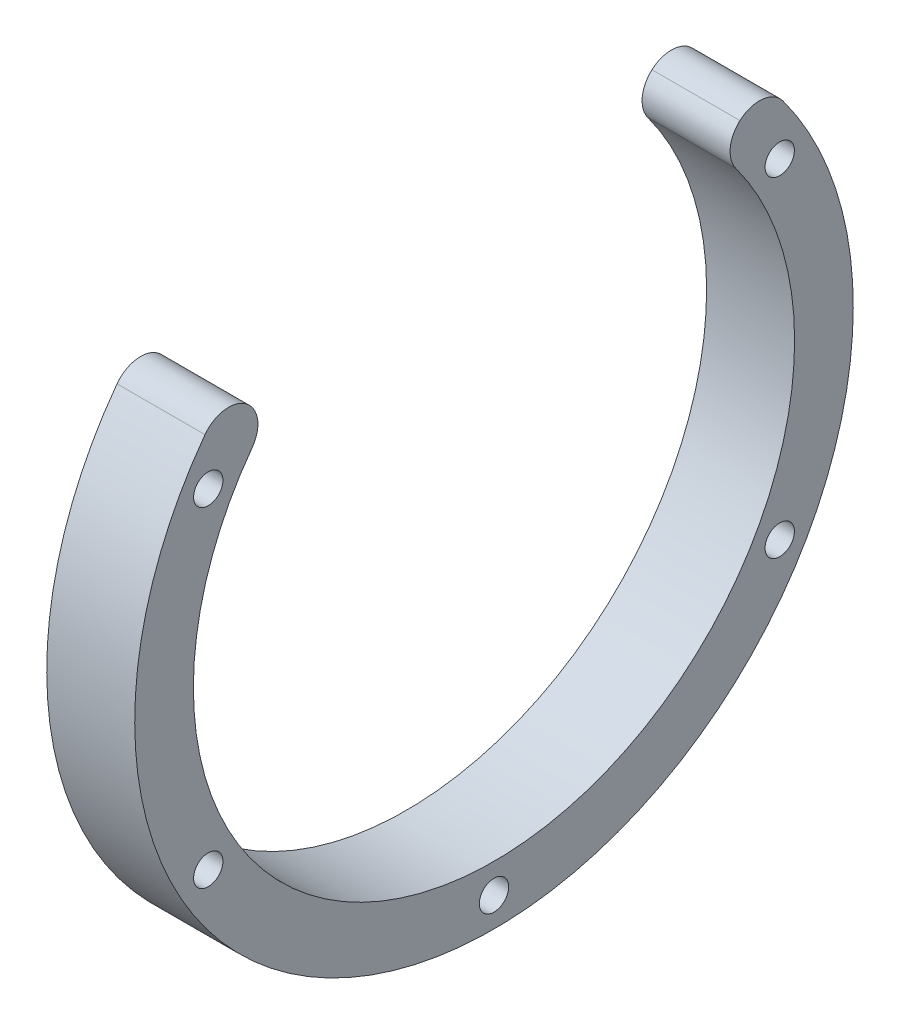
ISO-10303-21;
HEADER;
FILE_DESCRIPTION(('STEP AP214'),'2;1');
FILE_NAME('part.step','',(''),(''),'','','');
FILE_SCHEMA(('AUTOMOTIVE_DESIGN { 1 0 10303 214 1 1 1 1 }'));
ENDSEC;
DATA;
#1=APPLICATION_CONTEXT('core data for automotive mechanical design processes');
#2=APPLICATION_PROTOCOL_DEFINITION('international standard','automotive_design',2000,#1);
#3=PRODUCT_CONTEXT('',#1,'mechanical');
#4=PRODUCT('Part','Part','',(#3));
#5=PRODUCT_RELATED_PRODUCT_CATEGORY('part','',(#4));
#6=PRODUCT_DEFINITION_FORMATION('','',#4);
#7=PRODUCT_DEFINITION_CONTEXT('part definition',#1,'design');
#8=PRODUCT_DEFINITION('design','',#6,#7);
#9=PRODUCT_DEFINITION_SHAPE('','',#8);
#10=(LENGTH_UNIT() NAMED_UNIT(*) SI_UNIT(.MILLI.,.METRE.));
#11=(NAMED_UNIT(*) PLANE_ANGLE_UNIT() SI_UNIT($,.RADIAN.));
#12=(NAMED_UNIT(*) SI_UNIT($,.STERADIAN.) SOLID_ANGLE_UNIT());
#13=UNCERTAINTY_MEASURE_WITH_UNIT(LENGTH_MEASURE(1.E-05),#10,'distance_accuracy_value','');
#14=(GEOMETRIC_REPRESENTATION_CONTEXT(3) GLOBAL_UNCERTAINTY_ASSIGNED_CONTEXT((#13)) GLOBAL_UNIT_ASSIGNED_CONTEXT((#10,
#11,#12)) REPRESENTATION_CONTEXT('',''));
#15=CARTESIAN_POINT('',(0.,0.,0.));
#16=DIRECTION('',(0.,0.,1.));
#17=DIRECTION('',(1.,0.,0.));
#18=AXIS2_PLACEMENT_3D('',#15,#16,#17);
#19=CARTESIAN_POINT('',(12.,0.,0.));
#20=DIRECTION('',(1.,0.,0.));
#21=DIRECTION('',(0.,0.,-1.));
#22=AXIS2_PLACEMENT_3D('',#19,#20,#21);
#23=PLANE('',#22);
#24=CARTESIAN_POINT('',(12.,0.,0.));
#25=DIRECTION('',(1.,0.,0.));
#26=DIRECTION('',(0.,0.,-1.));
#27=AXIS2_PLACEMENT_3D('',#24,#25,#26);
#28=CIRCLE('',#27,49.);
#29=CARTESIAN_POINT('',(12.,29.1117207028777,39.414562254548));
#30=VERTEX_POINT('',#29);
#31=CARTESIAN_POINT('',(12.,29.1117207028777,-39.414562254548));
#32=VERTEX_POINT('',#31);
#33=EDGE_CURVE('E101',#30,#32,#28,.T.);
#34=ORIENTED_EDGE('',*,*,#33,.T.);
#35=CARTESIAN_POINT('',(12.,26.7352537067244,-36.1970469684624));
#36=DIRECTION('',(1.,0.,0.));
#37=DIRECTION('',(0.,0.,-1.));
#38=AXIS2_PLACEMENT_3D('',#35,#36,#37);
#39=CIRCLE('',#38,4.);
#40=CARTESIAN_POINT('',(12.,29.7287911023667,-33.5439857439727));
#41=VERTEX_POINT('',#40);
#42=EDGE_CURVE('E114',#32,#41,#39,.T.);
#43=ORIENTED_EDGE('',*,*,#42,.T.);
#44=CARTESIAN_POINT('',(12.,26.7352537067244,-36.1970469684624));
#45=DIRECTION('',(1.,0.,0.));
#46=DIRECTION('',(0.,0.,-1.));
#47=AXIS2_PLACEMENT_3D('',#44,#45,#46);
#48=CIRCLE('',#47,4.);
#49=CARTESIAN_POINT('',(12.,24.3587867105712,-32.9795316823769));
#50=VERTEX_POINT('',#49);
#51=EDGE_CURVE('E117',#41,#50,#48,.T.);
#52=ORIENTED_EDGE('',*,*,#51,.T.);
#53=CARTESIAN_POINT('',(12.,0.,0.));
#54=DIRECTION('',(1.,0.,0.));
#55=DIRECTION('',(0.,0.,-1.));
#56=AXIS2_PLACEMENT_3D('',#53,#54,#55);
#57=CIRCLE('',#56,41.);
#58=CARTESIAN_POINT('',(12.,24.3587867105712,32.9795316823769));
#59=VERTEX_POINT('',#58);
#60=EDGE_CURVE('E109',#59,#50,#57,.T.);
#61=ORIENTED_EDGE('',*,*,#60,.F.);
#62=CARTESIAN_POINT('',(12.,26.7352537067244,36.1970469684624));
#63=DIRECTION('',(1.,0.,0.));
#64=DIRECTION('',(0.,0.,-1.));
#65=AXIS2_PLACEMENT_3D('',#62,#63,#64);
#66=CIRCLE('',#65,4.);
#67=CARTESIAN_POINT('',(12.,29.7287911023667,33.5439857439727));
#68=VERTEX_POINT('',#67);
#69=EDGE_CURVE('E134',#59,#68,#66,.T.);
#70=ORIENTED_EDGE('',*,*,#69,.T.);
#71=CARTESIAN_POINT('',(12.,26.7352537067244,36.1970469684624));
#72=DIRECTION('',(1.,0.,0.));
#73=DIRECTION('',(0.,0.,-1.));
#74=AXIS2_PLACEMENT_3D('',#71,#72,#73);
#75=CIRCLE('',#74,4.);
#76=EDGE_CURVE('E155',#68,#30,#75,.T.);
#77=ORIENTED_EDGE('',*,*,#76,.T.);
#78=EDGE_LOOP('',(#34,#43,#52,#61,#70,#77));
#79=FACE_BOUND('',#78,.T.);
#80=CARTESIAN_POINT('',(12.,22.5000000000005,-38.9711431702995));
#81=DIRECTION('',(1.,0.,0.));
#82=DIRECTION('',(0.,0.,-1.));
#83=AXIS2_PLACEMENT_3D('',#80,#81,#82);
#84=CIRCLE('',#83,1.99999999999999);
#85=CARTESIAN_POINT('',(12.,22.5000000000005,-40.9711431702995));
#86=VERTEX_POINT('',#85);
#87=EDGE_CURVE('E126',#86,#86,#84,.T.);
#88=ORIENTED_EDGE('',*,*,#87,.F.);
#89=EDGE_LOOP('',(#88));
#90=FACE_BOUND('',#89,.T.);
#91=CARTESIAN_POINT('',(12.,-22.4999999999996,-38.9711431702999));
#92=DIRECTION('',(1.,0.,0.));
#93=DIRECTION('',(0.,0.,-1.));
#94=AXIS2_PLACEMENT_3D('',#91,#92,#93);
#95=CIRCLE('',#94,1.99999999999999);
#96=CARTESIAN_POINT('',(12.,-22.4999999999996,-40.9711431702999));
#97=VERTEX_POINT('',#96);
#98=EDGE_CURVE('E215',#97,#97,#95,.T.);
#99=ORIENTED_EDGE('',*,*,#98,.F.);
#100=EDGE_LOOP('',(#99));
#101=FACE_BOUND('',#100,.T.);
#102=CARTESIAN_POINT('',(12.,-45.,0.));
#103=DIRECTION('',(1.,0.,0.));
#104=DIRECTION('',(0.,0.,-1.));
#105=AXIS2_PLACEMENT_3D('',#102,#103,#104);
#106=CIRCLE('',#105,1.99999999999999);
#107=CARTESIAN_POINT('',(12.,-45.,-1.99999999999999));
#108=VERTEX_POINT('',#107);
#109=EDGE_CURVE('E223',#108,#108,#106,.T.);
#110=ORIENTED_EDGE('',*,*,#109,.F.);
#111=EDGE_LOOP('',(#110));
#112=FACE_BOUND('',#111,.T.);
#113=CARTESIAN_POINT('',(12.,-22.5000000000002,38.9711431702996));
#114=DIRECTION('',(1.,0.,0.));
#115=DIRECTION('',(0.,0.,-1.));
#116=AXIS2_PLACEMENT_3D('',#113,#114,#115);
#117=CIRCLE('',#116,1.99999999999999);
#118=CARTESIAN_POINT('',(12.,-22.5000000000002,36.9711431702996));
#119=VERTEX_POINT('',#118);
#120=EDGE_CURVE('E152',#119,#119,#117,.T.);
#121=ORIENTED_EDGE('',*,*,#120,.F.);
#122=EDGE_LOOP('',(#121));
#123=FACE_BOUND('',#122,.T.);
#124=CARTESIAN_POINT('',(12.,22.4999999999999,38.9711431702998));
#125=DIRECTION('',(1.,0.,0.));
#126=DIRECTION('',(0.,0.,-1.));
#127=AXIS2_PLACEMENT_3D('',#124,#125,#126);
#128=CIRCLE('',#127,1.99999999999999);
#129=CARTESIAN_POINT('',(12.,22.4999999999999,36.9711431702998));
#130=VERTEX_POINT('',#129);
#131=EDGE_CURVE('E146',#130,#130,#128,.T.);
#132=ORIENTED_EDGE('',*,*,#131,.F.);
#133=EDGE_LOOP('',(#132));
#134=FACE_BOUND('',#133,.T.);
#135=ADVANCED_FACE('F39',(#79,#90,#101,#112,#123,#134),#23,.T.);
#136=CARTESIAN_POINT('',(0.,0.,0.));
#137=DIRECTION('',(1.,0.,0.));
#138=DIRECTION('',(0.,0.,-1.));
#139=AXIS2_PLACEMENT_3D('',#136,#137,#138);
#140=PLANE('',#139);
#141=CARTESIAN_POINT('',(0.,22.5000000000005,-38.9711431702995));
#142=DIRECTION('',(1.,0.,0.));
#143=DIRECTION('',(0.,0.,-1.));
#144=AXIS2_PLACEMENT_3D('',#141,#142,#143);
#145=CIRCLE('',#144,1.99999999999999);
#146=CARTESIAN_POINT('',(0.,22.5000000000005,-40.9711431702995));
#147=VERTEX_POINT('',#146);
#148=EDGE_CURVE('E129',#147,#147,#145,.T.);
#149=ORIENTED_EDGE('',*,*,#148,.T.);
#150=EDGE_LOOP('',(#149));
#151=FACE_BOUND('',#150,.T.);
#152=CARTESIAN_POINT('',(0.,-22.4999999999996,-38.9711431702999));
#153=DIRECTION('',(1.,0.,0.));
#154=DIRECTION('',(0.,0.,-1.));
#155=AXIS2_PLACEMENT_3D('',#152,#153,#154);
#156=CIRCLE('',#155,1.99999999999999);
#157=CARTESIAN_POINT('',(0.,-22.4999999999996,-40.9711431702999));
#158=VERTEX_POINT('',#157);
#159=EDGE_CURVE('E218',#158,#158,#156,.T.);
#160=ORIENTED_EDGE('',*,*,#159,.T.);
#161=EDGE_LOOP('',(#160));
#162=FACE_BOUND('',#161,.T.);
#163=CARTESIAN_POINT('',(0.,-45.,0.));
#164=DIRECTION('',(1.,0.,0.));
#165=DIRECTION('',(0.,0.,-1.));
#166=AXIS2_PLACEMENT_3D('',#163,#164,#165);
#167=CIRCLE('',#166,1.99999999999999);
#168=CARTESIAN_POINT('',(0.,-45.,-1.99999999999999));
#169=VERTEX_POINT('',#168);
#170=EDGE_CURVE('E226',#169,#169,#167,.T.);
#171=ORIENTED_EDGE('',*,*,#170,.T.);
#172=EDGE_LOOP('',(#171));
#173=FACE_BOUND('',#172,.T.);
#174=CARTESIAN_POINT('',(0.,-22.5000000000002,38.9711431702996));
#175=DIRECTION('',(1.,0.,0.));
#176=DIRECTION('',(0.,0.,-1.));
#177=AXIS2_PLACEMENT_3D('',#174,#175,#176);
#178=CIRCLE('',#177,1.99999999999999);
#179=CARTESIAN_POINT('',(0.,-22.5000000000002,36.9711431702996));
#180=VERTEX_POINT('',#179);
#181=EDGE_CURVE('E150',#180,#180,#178,.T.);
#182=ORIENTED_EDGE('',*,*,#181,.T.);
#183=EDGE_LOOP('',(#182));
#184=FACE_BOUND('',#183,.T.);
#185=CARTESIAN_POINT('',(0.,22.4999999999999,38.9711431702998));
#186=DIRECTION('',(1.,0.,0.));
#187=DIRECTION('',(0.,0.,-1.));
#188=AXIS2_PLACEMENT_3D('',#185,#186,#187);
#189=CIRCLE('',#188,1.99999999999999);
#190=CARTESIAN_POINT('',(0.,22.4999999999999,36.9711431702998));
#191=VERTEX_POINT('',#190);
#192=EDGE_CURVE('E142',#191,#191,#189,.T.);
#193=ORIENTED_EDGE('',*,*,#192,.T.);
#194=EDGE_LOOP('',(#193));
#195=FACE_BOUND('',#194,.T.);
#196=CARTESIAN_POINT('',(0.,26.7352537067244,-36.1970469684624));
#197=DIRECTION('',(1.,0.,0.));
#198=DIRECTION('',(0.,0.,-1.));
#199=AXIS2_PLACEMENT_3D('',#196,#197,#198);
#200=CIRCLE('',#199,4.);
#201=CARTESIAN_POINT('',(0.,24.3587867105712,-32.9795316823769));
#202=VERTEX_POINT('',#201);
#203=CARTESIAN_POINT('',(0.,29.7287911023667,-33.5439857439727));
#204=VERTEX_POINT('',#203);
#205=EDGE_CURVE('E63',#202,#204,#200,.F.);
#206=ORIENTED_EDGE('',*,*,#205,.T.);
#207=CARTESIAN_POINT('',(0.,26.7352537067244,-36.1970469684624));
#208=DIRECTION('',(1.,0.,0.));
#209=DIRECTION('',(0.,0.,-1.));
#210=AXIS2_PLACEMENT_3D('',#207,#208,#209);
#211=CIRCLE('',#210,4.);
#212=CARTESIAN_POINT('',(0.,29.1117207028777,-39.414562254548));
#213=VERTEX_POINT('',#212);
#214=EDGE_CURVE('E108',#204,#213,#211,.F.);
#215=ORIENTED_EDGE('',*,*,#214,.T.);
#216=CARTESIAN_POINT('',(0.,0.,0.));
#217=DIRECTION('',(1.,0.,0.));
#218=DIRECTION('',(0.,0.,-1.));
#219=AXIS2_PLACEMENT_3D('',#216,#217,#218);
#220=CIRCLE('',#219,49.);
#221=CARTESIAN_POINT('',(0.,29.1117207028777,39.414562254548));
#222=VERTEX_POINT('',#221);
#223=EDGE_CURVE('E98',#222,#213,#220,.T.);
#224=ORIENTED_EDGE('',*,*,#223,.F.);
#225=CARTESIAN_POINT('',(0.,26.7352537067244,36.1970469684624));
#226=DIRECTION('',(1.,0.,0.));
#227=DIRECTION('',(0.,0.,-1.));
#228=AXIS2_PLACEMENT_3D('',#225,#226,#227);
#229=CIRCLE('',#228,4.);
#230=CARTESIAN_POINT('',(0.,29.7287911023667,33.5439857439727));
#231=VERTEX_POINT('',#230);
#232=EDGE_CURVE('E56',#222,#231,#229,.F.);
#233=ORIENTED_EDGE('',*,*,#232,.T.);
#234=CARTESIAN_POINT('',(0.,26.7352537067244,36.1970469684624));
#235=DIRECTION('',(1.,0.,0.));
#236=DIRECTION('',(0.,0.,-1.));
#237=AXIS2_PLACEMENT_3D('',#234,#235,#236);
#238=CIRCLE('',#237,4.);
#239=CARTESIAN_POINT('',(0.,24.3587867105712,32.9795316823769));
#240=VERTEX_POINT('',#239);
#241=EDGE_CURVE('E113',#231,#240,#238,.F.);
#242=ORIENTED_EDGE('',*,*,#241,.T.);
#243=CARTESIAN_POINT('',(0.,0.,0.));
#244=DIRECTION('',(1.,0.,0.));
#245=DIRECTION('',(0.,0.,-1.));
#246=AXIS2_PLACEMENT_3D('',#243,#244,#245);
#247=CIRCLE('',#246,41.);
#248=EDGE_CURVE('E136',#240,#202,#247,.T.);
#249=ORIENTED_EDGE('',*,*,#248,.T.);
#250=EDGE_LOOP('',(#206,#215,#224,#233,#242,#249));
#251=FACE_BOUND('',#250,.T.);
#252=ADVANCED_FACE('F106',(#151,#162,#173,#184,#195,#251),#140,.F.);
#253=CARTESIAN_POINT('',(12.,0.,0.));
#254=DIRECTION('',(-1.,0.,0.));
#255=DIRECTION('',(0.,0.,1.));
#256=AXIS2_PLACEMENT_3D('',#253,#254,#255);
#257=CYLINDRICAL_SURFACE('',#256,49.);
#258=ORIENTED_EDGE('',*,*,#223,.T.);
#259=DIRECTION('',(-1.,0.,0.));
#260=VECTOR('',#259,1.);
#261=CARTESIAN_POINT('',(12.,29.1117207028777,-39.414562254548));
#262=LINE('',#261,#260);
#263=EDGE_CURVE('E104',#213,#32,#262,.F.);
#264=ORIENTED_EDGE('',*,*,#263,.T.);
#265=ORIENTED_EDGE('',*,*,#33,.F.);
#266=DIRECTION('',(-1.,0.,0.));
#267=VECTOR('',#266,1.);
#268=CARTESIAN_POINT('',(12.,29.1117207028777,39.414562254548));
#269=LINE('',#268,#267);
#270=EDGE_CURVE('E95',#30,#222,#269,.T.);
#271=ORIENTED_EDGE('',*,*,#270,.T.);
#272=EDGE_LOOP('',(#258,#264,#265,#271));
#273=FACE_BOUND('',#272,.T.);
#274=ADVANCED_FACE('F96',(#273),#257,.T.);
#275=CARTESIAN_POINT('',(12.,0.,0.));
#276=DIRECTION('',(-1.,0.,0.));
#277=DIRECTION('',(0.,0.,1.));
#278=AXIS2_PLACEMENT_3D('',#275,#276,#277);
#279=CYLINDRICAL_SURFACE('',#278,41.);
#280=ORIENTED_EDGE('',*,*,#60,.T.);
#281=DIRECTION('',(-1.,0.,0.));
#282=VECTOR('',#281,1.);
#283=CARTESIAN_POINT('',(12.,24.3587867105712,-32.9795316823769));
#284=LINE('',#283,#282);
#285=EDGE_CURVE('E11',#50,#202,#284,.T.);
#286=ORIENTED_EDGE('',*,*,#285,.T.);
#287=ORIENTED_EDGE('',*,*,#248,.F.);
#288=DIRECTION('',(-1.,0.,0.));
#289=VECTOR('',#288,1.);
#290=CARTESIAN_POINT('',(12.,24.3587867105712,32.9795316823769));
#291=LINE('',#290,#289);
#292=EDGE_CURVE('E48',#240,#59,#291,.F.);
#293=ORIENTED_EDGE('',*,*,#292,.T.);
#294=EDGE_LOOP('',(#280,#286,#287,#293));
#295=FACE_BOUND('',#294,.T.);
#296=ADVANCED_FACE('F139',(#295),#279,.F.);
#297=CARTESIAN_POINT('',(12.,22.4999999999999,38.9711431702998));
#298=DIRECTION('',(1.,0.,0.));
#299=DIRECTION('',(0.,0.,-1.));
#300=AXIS2_PLACEMENT_3D('',#297,#298,#299);
#301=CYLINDRICAL_SURFACE('',#300,1.99999999999999);
#302=ORIENTED_EDGE('',*,*,#131,.T.);
#303=EDGE_LOOP('',(#302));
#304=FACE_BOUND('',#303,.T.);
#305=ORIENTED_EDGE('',*,*,#192,.F.);
#306=EDGE_LOOP('',(#305));
#307=FACE_BOUND('',#306,.T.);
#308=ADVANCED_FACE('F185',(#304,#307),#301,.F.);
#309=CARTESIAN_POINT('',(12.,-22.5000000000002,38.9711431702996));
#310=DIRECTION('',(1.,0.,0.));
#311=DIRECTION('',(0.,0.,-1.));
#312=AXIS2_PLACEMENT_3D('',#309,#310,#311);
#313=CYLINDRICAL_SURFACE('',#312,1.99999999999999);
#314=ORIENTED_EDGE('',*,*,#120,.T.);
#315=EDGE_LOOP('',(#314));
#316=FACE_BOUND('',#315,.T.);
#317=ORIENTED_EDGE('',*,*,#181,.F.);
#318=EDGE_LOOP('',(#317));
#319=FACE_BOUND('',#318,.T.);
#320=ADVANCED_FACE('F189',(#316,#319),#313,.F.);
#321=CARTESIAN_POINT('',(12.,-45.,0.));
#322=DIRECTION('',(1.,0.,0.));
#323=DIRECTION('',(0.,0.,-1.));
#324=AXIS2_PLACEMENT_3D('',#321,#322,#323);
#325=CYLINDRICAL_SURFACE('',#324,1.99999999999999);
#326=ORIENTED_EDGE('',*,*,#109,.T.);
#327=EDGE_LOOP('',(#326));
#328=FACE_BOUND('',#327,.T.);
#329=ORIENTED_EDGE('',*,*,#170,.F.);
#330=EDGE_LOOP('',(#329));
#331=FACE_BOUND('',#330,.T.);
#332=ADVANCED_FACE('F194',(#328,#331),#325,.F.);
#333=CARTESIAN_POINT('',(12.,-22.4999999999996,-38.9711431702999));
#334=DIRECTION('',(1.,0.,0.));
#335=DIRECTION('',(0.,0.,-1.));
#336=AXIS2_PLACEMENT_3D('',#333,#334,#335);
#337=CYLINDRICAL_SURFACE('',#336,1.99999999999999);
#338=ORIENTED_EDGE('',*,*,#98,.T.);
#339=EDGE_LOOP('',(#338));
#340=FACE_BOUND('',#339,.T.);
#341=ORIENTED_EDGE('',*,*,#159,.F.);
#342=EDGE_LOOP('',(#341));
#343=FACE_BOUND('',#342,.T.);
#344=ADVANCED_FACE('F202',(#340,#343),#337,.F.);
#345=CARTESIAN_POINT('',(12.,22.5000000000005,-38.9711431702995));
#346=DIRECTION('',(1.,0.,0.));
#347=DIRECTION('',(0.,0.,-1.));
#348=AXIS2_PLACEMENT_3D('',#345,#346,#347);
#349=CYLINDRICAL_SURFACE('',#348,1.99999999999999);
#350=ORIENTED_EDGE('',*,*,#87,.T.);
#351=EDGE_LOOP('',(#350));
#352=FACE_BOUND('',#351,.T.);
#353=ORIENTED_EDGE('',*,*,#148,.F.);
#354=EDGE_LOOP('',(#353));
#355=FACE_BOUND('',#354,.T.);
#356=ADVANCED_FACE('F169',(#352,#355),#349,.F.);
#357=CARTESIAN_POINT('',(12.,26.7352537067244,-36.1970469684624));
#358=DIRECTION('',(-1.,0.,0.));
#359=DIRECTION('',(0.,0.,1.));
#360=AXIS2_PLACEMENT_3D('',#357,#358,#359);
#361=CYLINDRICAL_SURFACE('',#360,4.);
#362=DIRECTION('',(1.,0.,0.));
#363=VECTOR('',#362,1.);
#364=CARTESIAN_POINT('',(12.,29.7287911023667,-33.5439857439727));
#365=LINE('',#364,#363);
#366=EDGE_CURVE('E124',#204,#41,#365,.T.);
#367=ORIENTED_EDGE('',*,*,#366,.F.);
#368=ORIENTED_EDGE('',*,*,#205,.F.);
#369=ORIENTED_EDGE('',*,*,#285,.F.);
#370=ORIENTED_EDGE('',*,*,#51,.F.);
#371=EDGE_LOOP('',(#367,#368,#369,#370));
#372=FACE_BOUND('',#371,.T.);
#373=ADVANCED_FACE('F161',(#372),#361,.T.);
#374=CARTESIAN_POINT('',(12.,26.7352537067244,-36.1970469684624));
#375=DIRECTION('',(-1.,0.,0.));
#376=DIRECTION('',(0.,0.,1.));
#377=AXIS2_PLACEMENT_3D('',#374,#375,#376);
#378=CYLINDRICAL_SURFACE('',#377,4.);
#379=ORIENTED_EDGE('',*,*,#214,.F.);
#380=ORIENTED_EDGE('',*,*,#366,.T.);
#381=ORIENTED_EDGE('',*,*,#42,.F.);
#382=ORIENTED_EDGE('',*,*,#263,.F.);
#383=EDGE_LOOP('',(#379,#380,#381,#382));
#384=FACE_BOUND('',#383,.T.);
#385=ADVANCED_FACE('F162',(#384),#378,.T.);
#386=CARTESIAN_POINT('',(12.,26.7352537067244,36.1970469684624));
#387=DIRECTION('',(-1.,0.,0.));
#388=DIRECTION('',(0.,0.,1.));
#389=AXIS2_PLACEMENT_3D('',#386,#387,#388);
#390=CYLINDRICAL_SURFACE('',#389,4.);
#391=ORIENTED_EDGE('',*,*,#270,.F.);
#392=ORIENTED_EDGE('',*,*,#76,.F.);
#393=DIRECTION('',(-1.,0.,0.));
#394=VECTOR('',#393,1.);
#395=CARTESIAN_POINT('',(0.,29.7287911023667,33.5439857439727));
#396=LINE('',#395,#394);
#397=EDGE_CURVE('E43',#231,#68,#396,.F.);
#398=ORIENTED_EDGE('',*,*,#397,.F.);
#399=ORIENTED_EDGE('',*,*,#232,.F.);
#400=EDGE_LOOP('',(#391,#392,#398,#399));
#401=FACE_BOUND('',#400,.T.);
#402=ADVANCED_FACE('F41',(#401),#390,.T.);
#403=CARTESIAN_POINT('',(12.,26.7352537067244,36.1970469684624));
#404=DIRECTION('',(-1.,0.,0.));
#405=DIRECTION('',(0.,0.,1.));
#406=AXIS2_PLACEMENT_3D('',#403,#404,#405);
#407=CYLINDRICAL_SURFACE('',#406,4.);
#408=ORIENTED_EDGE('',*,*,#69,.F.);
#409=ORIENTED_EDGE('',*,*,#292,.F.);
#410=ORIENTED_EDGE('',*,*,#241,.F.);
#411=ORIENTED_EDGE('',*,*,#397,.T.);
#412=EDGE_LOOP('',(#408,#409,#410,#411));
#413=FACE_BOUND('',#412,.T.);
#414=ADVANCED_FACE('F132',(#413),#407,.T.);
#415=CLOSED_SHELL('',(#135,#252,#274,#296,#308,#320,#332,#344,#356,#373,#385,#402,#414));
#416=MANIFOLD_SOLID_BREP('B2',#415);
#417=ADVANCED_BREP_SHAPE_REPRESENTATION('',(#18,#416),#14);
#418=SHAPE_DEFINITION_REPRESENTATION(#9,#417);
ENDSEC;
END-ISO-10303-21;
